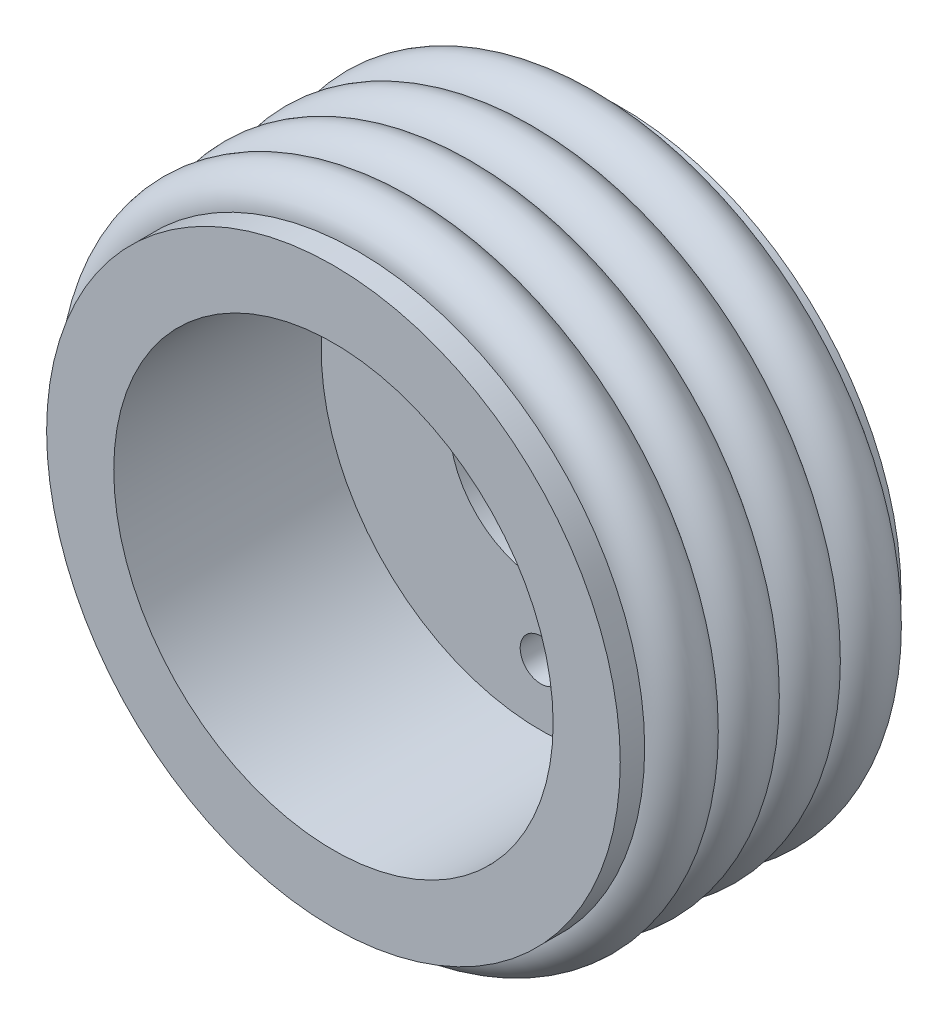
ISO-10303-21;
HEADER;
FILE_DESCRIPTION(('STEP AP214'),'2;1');
FILE_NAME('part.step','',(''),(''),'','','');
FILE_SCHEMA(('AUTOMOTIVE_DESIGN { 1 0 10303 214 1 1 1 1 }'));
ENDSEC;
DATA;
#1=APPLICATION_CONTEXT('core data for automotive mechanical design processes');
#2=APPLICATION_PROTOCOL_DEFINITION('international standard','automotive_design',2000,#1);
#3=PRODUCT_CONTEXT('',#1,'mechanical');
#4=PRODUCT('Part','Part','',(#3));
#5=PRODUCT_RELATED_PRODUCT_CATEGORY('part','',(#4));
#6=PRODUCT_DEFINITION_FORMATION('','',#4);
#7=PRODUCT_DEFINITION_CONTEXT('part definition',#1,'design');
#8=PRODUCT_DEFINITION('design','',#6,#7);
#9=PRODUCT_DEFINITION_SHAPE('','',#8);
#10=(LENGTH_UNIT() NAMED_UNIT(*) SI_UNIT(.MILLI.,.METRE.));
#11=(NAMED_UNIT(*) PLANE_ANGLE_UNIT() SI_UNIT($,.RADIAN.));
#12=(NAMED_UNIT(*) SI_UNIT($,.STERADIAN.) SOLID_ANGLE_UNIT());
#13=UNCERTAINTY_MEASURE_WITH_UNIT(LENGTH_MEASURE(1.E-05),#10,'distance_accuracy_value','');
#14=(GEOMETRIC_REPRESENTATION_CONTEXT(3) GLOBAL_UNCERTAINTY_ASSIGNED_CONTEXT((#13)) GLOBAL_UNIT_ASSIGNED_CONTEXT((#10,
#11,#12)) REPRESENTATION_CONTEXT('',''));
#15=CARTESIAN_POINT('',(0.,0.,0.));
#16=DIRECTION('',(0.,0.,1.));
#17=DIRECTION('',(1.,0.,0.));
#18=AXIS2_PLACEMENT_3D('',#15,#16,#17);
#19=CARTESIAN_POINT('',(0.,0.,-11.75));
#20=DIRECTION('',(0.,0.,-1.));
#21=DIRECTION('',(1.,0.,0.));
#22=AXIS2_PLACEMENT_3D('',#19,#20,#21);
#23=CYLINDRICAL_SURFACE('',#22,21.);
#24=CARTESIAN_POINT('',(0.,0.,9.75));
#25=DIRECTION('',(0.,0.,1.));
#26=DIRECTION('',(1.,0.,0.));
#27=AXIS2_PLACEMENT_3D('',#24,#25,#26);
#28=CIRCLE('',#27,21.);
#29=CARTESIAN_POINT('',(0.,21.,9.75));
#30=VERTEX_POINT('',#29);
#31=EDGE_CURVE('E77',#30,#30,#28,.T.);
#32=ORIENTED_EDGE('',*,*,#31,.F.);
#33=CARTESIAN_POINT('',(0.,21.,9.75));
#34=CARTESIAN_POINT('',(-0.0561363038988771,20.9999996811273,9.74999752135984));
#35=CARTESIAN_POINT('',(-0.112312501141531,20.9997724969274,9.74525719854788));
#36=CARTESIAN_POINT('',(-0.223115433296866,20.9988880545972,9.7264142023614));
#37=CARTESIAN_POINT('',(-0.27774025943396,20.9982302887367,9.71230047583736));
#38=CARTESIAN_POINT('',(-0.383819311213126,20.9965591372719,9.675115465787));
#39=CARTESIAN_POINT('',(-0.435275128016128,20.9955459318736,9.65204872076832));
#40=CARTESIAN_POINT('',(-0.533570370949644,20.9932780382918,9.59761936176998));
#41=CARTESIAN_POINT('',(-0.580410888609561,20.9920234074143,9.56625871581298));
#42=CARTESIAN_POINT('',(-0.668203464024752,20.9894125161618,9.49609918178456));
#43=CARTESIAN_POINT('',(-0.709150712799859,20.9880561741467,9.45729427866645));
#44=CARTESIAN_POINT('',(-0.783953466933909,20.9853954341331,9.37335966149667));
#45=CARTESIAN_POINT('',(-0.817808683669856,20.9840910382503,9.32822969015969));
#46=CARTESIAN_POINT('',(-0.877479198286772,20.9816807168435,9.23290130925095));
#47=CARTESIAN_POINT('',(-0.903290803156075,20.9805748825823,9.18270058554188));
#48=CARTESIAN_POINT('',(-0.946117685640341,20.9786873636158,9.07867201809471));
#49=CARTESIAN_POINT('',(-0.963133025422213,20.9779056766198,9.02484419999387));
#50=CARTESIAN_POINT('',(-0.987871838374909,20.9767553280768,8.91513309862436));
#51=CARTESIAN_POINT('',(-0.995602416726948,20.976386350718,8.85925142087096));
#52=CARTESIAN_POINT('',(-1.00157418334509,20.9761020812373,8.74698241613607));
#53=CARTESIAN_POINT('',(-0.999815441116711,20.9761867857924,8.69059509286125));
#54=CARTESIAN_POINT('',(-0.986864415771587,20.9768000345494,8.57896370364238));
#55=CARTESIAN_POINT('',(-0.975679808408722,20.9773282176127,8.52371874492955));
#56=CARTESIAN_POINT('',(-0.944206435455782,20.9787683216876,8.4158913813039));
#57=CARTESIAN_POINT('',(-0.923917634063143,20.9796802442083,8.36330898686262));
#58=CARTESIAN_POINT('',(-0.874803024000611,20.9817854593617,8.26227463931984));
#59=CARTESIAN_POINT('',(-0.84597371304432,20.9829788673847,8.21382439124423));
#60=CARTESIAN_POINT('',(-0.780598997705031,20.9855124233405,8.12244831396283));
#61=CARTESIAN_POINT('',(-0.744053544211555,20.9868525722071,8.079522519921));
#62=CARTESIAN_POINT('',(-0.664240605170176,20.9895301635977,8.00036917720809));
#63=CARTESIAN_POINT('',(-0.620966471781964,20.9908676021056,7.96414833129921));
#64=CARTESIAN_POINT('',(-0.52894794122871,20.9933877425387,7.89948470412643));
#65=CARTESIAN_POINT('',(-0.480203542796952,20.9945704444281,7.87104192466365));
#66=CARTESIAN_POINT('',(-0.378624262007521,20.9966478613264,7.82274247311842));
#67=CARTESIAN_POINT('',(-0.325789269850134,20.9975425686017,7.80288603160471));
#68=CARTESIAN_POINT('',(-0.217530322004393,20.9989430441434,7.772327273432));
#69=CARTESIAN_POINT('',(-0.162106383907505,20.9994488150522,7.76162489458217));
#70=CARTESIAN_POINT('',(-0.0503010224865294,21.0000140755397,7.74968631711494));
#71=CARTESIAN_POINT('',(0.00607940869278546,21.0000740022307,7.74844084678025));
#72=CARTESIAN_POINT('',(0.118248476151765,20.9997419804265,7.75542724949942));
#73=CARTESIAN_POINT('',(0.174037114203099,20.9993500332844,7.76365909417267));
#74=CARTESIAN_POINT('',(0.283413000445086,20.9981586951108,7.78935878129773));
#75=CARTESIAN_POINT('',(0.337001244760644,20.9973594906932,7.80682239369487));
#76=CARTESIAN_POINT('',(0.440485842440502,20.9954436287698,7.85048560023469));
#77=CARTESIAN_POINT('',(0.490382176546033,20.9943269696081,7.87668523994473));
#78=CARTESIAN_POINT('',(0.585109169143699,20.9919007529685,7.93710054849867));
#79=CARTESIAN_POINT('',(0.62993585746517,20.9905910461334,7.97132243620837));
#80=CARTESIAN_POINT('',(0.713211181457512,20.9879267461132,8.04680171479698));
#81=CARTESIAN_POINT('',(0.751659779802339,20.9865721526654,8.08805914684664));
#82=CARTESIAN_POINT('',(0.821118689748084,20.9839695151814,8.17647823223026));
#83=CARTESIAN_POINT('',(0.852123005059919,20.9827215575569,8.22364459892427));
#84=CARTESIAN_POINT('',(0.90577227043327,20.980474271694,8.32251883205619));
#85=CARTESIAN_POINT('',(0.928417254344898,20.9794749424489,8.37422668010286));
#86=CARTESIAN_POINT('',(0.964694583406498,20.9778382170924,8.48069381289652));
#87=CARTESIAN_POINT('',(0.978330759329323,20.9772006671595,8.53545178989719));
#88=CARTESIAN_POINT('',(0.996215923908415,20.976358960133,8.64648312915979));
#89=CARTESIAN_POINT('',(1.00046495929589,20.9761548008819,8.70275648387641));
#90=CARTESIAN_POINT('',(0.999454776551576,20.9762029522932,8.81516147431866));
#91=CARTESIAN_POINT('',(0.994204993279052,20.9764548100094,8.87129319527461));
#92=CARTESIAN_POINT('',(0.974365687272199,20.9773856516208,8.9818774089297));
#93=CARTESIAN_POINT('',(0.959776146615082,20.9780646363355,9.03632989840624));
#94=CARTESIAN_POINT('',(0.921673350457397,20.9797731033517,9.14201204336561));
#95=CARTESIAN_POINT('',(0.898160013112034,20.9808025888678,9.19324166928486));
#96=CARTESIAN_POINT('',(0.842878804483335,20.9830959888515,9.2910265033339));
#97=CARTESIAN_POINT('',(0.811111193018686,20.9843598959398,9.33758185853114));
#98=CARTESIAN_POINT('',(0.740189753734843,20.9869811044061,9.42474352556779));
#99=CARTESIAN_POINT('',(0.701029419988857,20.9883384873735,9.46534454097217));
#100=CARTESIAN_POINT('',(0.616437094470653,20.9909931173752,9.53940858935266));
#101=CARTESIAN_POINT('',(0.571003560745194,20.9922903495193,9.57286986221631));
#102=CARTESIAN_POINT('',(0.475121488390931,20.9946793241869,9.63171876461425));
#103=CARTESIAN_POINT('',(0.424668410693327,20.9957708780911,9.65709899792059));
#104=CARTESIAN_POINT('',(0.320249897572316,20.99762261114,9.69899817802257));
#105=CARTESIAN_POINT('',(0.266288701804138,20.9983831820344,9.71552760595094));
#106=CARTESIAN_POINT('',(0.176659513778952,20.9992857723808,9.73491374376));
#107=CARTESIAN_POINT('',(0.141572250394051,20.9995524328427,9.74056388235601));
#108=CARTESIAN_POINT('',(0.0709953108205627,20.9999096474265,9.74810779288838));
#109=CARTESIAN_POINT('',(0.0355056349415617,21.0000002016837,9.75000156771442));
#110=CARTESIAN_POINT('',(0.,21.,9.75));
#111=B_SPLINE_CURVE_WITH_KNOTS('',3,(#33,#34,#35,#36,#37,#38,#39,#40,#41,#42,#43,#44,#45,#46,
#47,#48,#49,#50,#51,#52,#53,#54,#55,#56,#57,#58,#59,#60,#61,#62,#63,#64,#65,#66,#67,#68,#69,#70,
#71,#72,#73,#74,#75,#76,#77,#78,#79,#80,#81,#82,#83,#84,#85,#86,#87,#88,#89,#90,#91,#92,#93,#94,
#95,#96,#97,#98,#99,#100,#101,#102,#103,#104,#105,#106,#107,#108,#109,#110),.UNSPECIFIED.,.T.,
.F.,(4,2,2,2,2,2,2,2,2,2,2,2,2,2,2,2,2,2,2,2,2,2,2,2,2,2,2,2,2,2,2,2,2,2,2,2,2,2,4),(0.,
0.168279304152174,0.336757397002164,0.505150195428666,0.673503072475897,0.841992557974523,
1.01048889912417,1.1790624873233,1.3476348841256,1.51607819822157,1.68452027853856,
1.85282532400345,2.02113103133967,2.1895058531327,2.35788174660333,2.52642506265313,
2.69496841773153,2.86351629842006,3.03206303401975,3.20044450211068,3.36882546597069,
3.53712934339233,3.70543409870555,3.87386975825859,4.04230640350093,4.21087827086856,
4.37944945561711,4.54794891342144,4.71644753239733,4.88477887918966,5.05311054900712,
5.22144376271946,5.38977167847142,5.55824842679306,5.72676666068431,5.89543869163227,
6.06391053675276,6.17034554801619,6.27678047740181),.UNSPECIFIED.);
#112=EDGE_CURVE('E74',#30,#30,#111,.T.);
#113=ORIENTED_EDGE('',*,*,#112,.T.);
#114=EDGE_LOOP('',(#32,#113));
#115=FACE_BOUND('',#114,.T.);
#116=CARTESIAN_POINT('',(0.,0.,-10.25));
#117=DIRECTION('',(0.,0.,1.));
#118=DIRECTION('',(1.,0.,0.));
#119=AXIS2_PLACEMENT_3D('',#116,#117,#118);
#120=CIRCLE('',#119,21.);
#121=CARTESIAN_POINT('',(0.,21.,-10.25));
#122=VERTEX_POINT('',#121);
#123=EDGE_CURVE('E200',#122,#122,#120,.T.);
#124=ORIENTED_EDGE('',*,*,#123,.T.);
#125=CARTESIAN_POINT('',(0.,21.,-8.25));
#126=CARTESIAN_POINT('',(-0.0561363038988737,20.9999996811273,-8.25000247864016));
#127=CARTESIAN_POINT('',(-0.112312501141527,20.9997724969274,-8.25474280145213));
#128=CARTESIAN_POINT('',(-0.223115433296863,20.9988880545972,-8.27358579763861));
#129=CARTESIAN_POINT('',(-0.277740259433957,20.9982302887367,-8.28769952416264));
#130=CARTESIAN_POINT('',(-0.383819311213123,20.9965591372719,-8.32488453421301));
#131=CARTESIAN_POINT('',(-0.435275128016124,20.9955459318736,-8.34795127923169));
#132=CARTESIAN_POINT('',(-0.53357037094964,20.9932780382918,-8.40238063823003));
#133=CARTESIAN_POINT('',(-0.580410888609558,20.9920234074143,-8.43374128418703));
#134=CARTESIAN_POINT('',(-0.66820346402475,20.9894125161618,-8.50390081821545));
#135=CARTESIAN_POINT('',(-0.709150712799856,20.9880561741467,-8.54270572133356));
#136=CARTESIAN_POINT('',(-0.783953466933907,20.9853954341331,-8.62664033850333));
#137=CARTESIAN_POINT('',(-0.817808683669854,20.9840910382503,-8.67177030984032));
#138=CARTESIAN_POINT('',(-0.87747919828677,20.9816807168435,-8.76709869074906));
#139=CARTESIAN_POINT('',(-0.903290803156073,20.9805748825823,-8.81729941445813));
#140=CARTESIAN_POINT('',(-0.946117685640338,20.9786873636158,-8.92132798190529));
#141=CARTESIAN_POINT('',(-0.963133025422211,20.9779056766198,-8.97515580000614));
#142=CARTESIAN_POINT('',(-0.987871838374906,20.9767553280768,-9.08486690137565));
#143=CARTESIAN_POINT('',(-0.995602416726945,20.976386350718,-9.14074857912905));
#144=CARTESIAN_POINT('',(-1.00157418334509,20.9761020812373,-9.25301758386394));
#145=CARTESIAN_POINT('',(-0.999815441116708,20.9761867857924,-9.30940490713876));
#146=CARTESIAN_POINT('',(-0.986864415771584,20.9768000345494,-9.42103629635763));
#147=CARTESIAN_POINT('',(-0.975679808408718,20.9773282176127,-9.47628125507046));
#148=CARTESIAN_POINT('',(-0.944206435455779,20.9787683216876,-9.58410861869611));
#149=CARTESIAN_POINT('',(-0.92391763406314,20.9796802442083,-9.63669101313739));
#150=CARTESIAN_POINT('',(-0.874803024000608,20.9817854593617,-9.73772536068017));
#151=CARTESIAN_POINT('',(-0.845973713044317,20.9829788673847,-9.78617560875577));
#152=CARTESIAN_POINT('',(-0.780598997705028,20.9855124233405,-9.87755168603717));
#153=CARTESIAN_POINT('',(-0.744053544211551,20.9868525722071,-9.92047748007901));
#154=CARTESIAN_POINT('',(-0.664240605170172,20.9895301635977,-9.99963082279192));
#155=CARTESIAN_POINT('',(-0.62096647178196,20.9908676021056,-10.0358516687008));
#156=CARTESIAN_POINT('',(-0.528947941228705,20.9933877425387,-10.1005152958736));
#157=CARTESIAN_POINT('',(-0.480203542796948,20.9945704444281,-10.1289580753364));
#158=CARTESIAN_POINT('',(-0.378624262007517,20.9966478613264,-10.1772575268816));
#159=CARTESIAN_POINT('',(-0.325789269850129,20.9975425686017,-10.1971139683953));
#160=CARTESIAN_POINT('',(-0.217530322004388,20.9989430441434,-10.227672726568));
#161=CARTESIAN_POINT('',(-0.162106383907501,20.9994488150522,-10.2383751054178));
#162=CARTESIAN_POINT('',(-0.0503010224865254,21.0000140755397,-10.2503136828851));
#163=CARTESIAN_POINT('',(0.00607940869278955,21.0000740022307,-10.2515591532198));
#164=CARTESIAN_POINT('',(0.118248476151769,20.9997419804265,-10.2445727505006));
#165=CARTESIAN_POINT('',(0.174037114203103,20.9993500332844,-10.2363409058273));
#166=CARTESIAN_POINT('',(0.283413000445091,20.9981586951108,-10.2106412187023));
#167=CARTESIAN_POINT('',(0.337001244760649,20.9973594906932,-10.1931776063051));
#168=CARTESIAN_POINT('',(0.440485842440507,20.9954436287698,-10.1495143997653));
#169=CARTESIAN_POINT('',(0.490382176546038,20.9943269696081,-10.1233147600553));
#170=CARTESIAN_POINT('',(0.585109169143704,20.9919007529685,-10.0628994515013));
#171=CARTESIAN_POINT('',(0.629935857465176,20.9905910461334,-10.0286775637916));
#172=CARTESIAN_POINT('',(0.713211181457518,20.9879267461132,-9.95319828520303));
#173=CARTESIAN_POINT('',(0.751659779802344,20.9865721526654,-9.91194085315336));
#174=CARTESIAN_POINT('',(0.821118689748088,20.9839695151814,-9.82352176776975));
#175=CARTESIAN_POINT('',(0.852123005059924,20.9827215575569,-9.77635540107574));
#176=CARTESIAN_POINT('',(0.905772270433275,20.980474271694,-9.67748116794382));
#177=CARTESIAN_POINT('',(0.928417254344902,20.9794749424489,-9.62577331989714));
#178=CARTESIAN_POINT('',(0.964694583406502,20.9778382170924,-9.51930618710349));
#179=CARTESIAN_POINT('',(0.978330759329327,20.9772006671595,-9.46454821010281));
#180=CARTESIAN_POINT('',(0.996215923908419,20.976358960133,-9.35351687084022));
#181=CARTESIAN_POINT('',(1.00046495929589,20.9761548008819,-9.29724351612359));
#182=CARTESIAN_POINT('',(0.999454776551579,20.9762029522932,-9.18483852568135));
#183=CARTESIAN_POINT('',(0.994204993279055,20.9764548100094,-9.1287068047254));
#184=CARTESIAN_POINT('',(0.974365687272203,20.9773856516208,-9.0181225910703));
#185=CARTESIAN_POINT('',(0.959776146615085,20.9780646363355,-8.96367010159377));
#186=CARTESIAN_POINT('',(0.9216733504574,20.9797731033517,-8.85798795663439));
#187=CARTESIAN_POINT('',(0.898160013112037,20.9808025888678,-8.80675833071514));
#188=CARTESIAN_POINT('',(0.842878804483338,20.9830959888515,-8.70897349666611));
#189=CARTESIAN_POINT('',(0.811111193018688,20.9843598959398,-8.66241814146887));
#190=CARTESIAN_POINT('',(0.740189753734846,20.9869811044061,-8.57525647443222));
#191=CARTESIAN_POINT('',(0.701029419988859,20.9883384873735,-8.53465545902784));
#192=CARTESIAN_POINT('',(0.616437094470656,20.9909931173752,-8.46059141064735));
#193=CARTESIAN_POINT('',(0.571003560745196,20.9922903495193,-8.42713013778369));
#194=CARTESIAN_POINT('',(0.475121488390934,20.9946793241869,-8.36828123538576));
#195=CARTESIAN_POINT('',(0.42466841069333,20.995770878091,-8.34290100207942));
#196=CARTESIAN_POINT('',(0.320249897572319,20.99762261114,-8.30100182197744));
#197=CARTESIAN_POINT('',(0.266288701804141,20.9983831820344,-8.28447239404907));
#198=CARTESIAN_POINT('',(0.176659513778955,20.9992857723808,-8.26508625624001));
#199=CARTESIAN_POINT('',(0.141572250394054,20.9995524328427,-8.259436117644));
#200=CARTESIAN_POINT('',(0.0709953108205658,20.9999096474265,-8.25189220711163));
#201=CARTESIAN_POINT('',(0.0355056349415649,21.0000002016837,-8.24999843228559));
#202=CARTESIAN_POINT('',(0.,21.,-8.25));
#203=B_SPLINE_CURVE_WITH_KNOTS('',3,(#125,#126,#127,#128,#129,#130,#131,#132,#133,#134,#135,
#136,#137,#138,#139,#140,#141,#142,#143,#144,#145,#146,#147,#148,#149,#150,#151,#152,#153,#154,
#155,#156,#157,#158,#159,#160,#161,#162,#163,#164,#165,#166,#167,#168,#169,#170,#171,#172,#173,
#174,#175,#176,#177,#178,#179,#180,#181,#182,#183,#184,#185,#186,#187,#188,#189,#190,#191,#192,
#193,#194,#195,#196,#197,#198,#199,#200,#201,#202),.UNSPECIFIED.,.T.,.F.,(4,2,2,2,2,2,2,2,2,2,2,
2,2,2,2,2,2,2,2,2,2,2,2,2,2,2,2,2,2,2,2,2,2,2,2,2,2,2,4),(0.,0.168279304152174,
0.336757397002165,0.505150195428666,0.673503072475898,0.841992557974524,1.01048889912418,
1.1790624873233,1.3476348841256,1.51607819822157,1.68452027853856,1.85282532400345,
2.02113103133967,2.1895058531327,2.35788174660333,2.52642506265313,2.69496841773153,
2.86351629842007,3.03206303401975,3.20044450211068,3.36882546597069,3.53712934339233,
3.70543409870556,3.87386975825859,4.04230640350094,4.21087827086856,4.37944945561712,
4.54794891342144,4.71644753239733,4.88477887918967,5.05311054900713,5.22144376271946,
5.38977167847143,5.55824842679306,5.72676666068431,5.89543869163227,6.06391053675277,
6.17034554801619,6.27678047740182),.UNSPECIFIED.);
#204=EDGE_CURVE('E86',#122,#122,#203,.T.);
#205=ORIENTED_EDGE('',*,*,#204,.T.);
#206=EDGE_LOOP('',(#124,#205));
#207=FACE_BOUND('',#206,.T.);
#208=ADVANCED_FACE('F46',(#115,#207),#23,.T.);
#209=CARTESIAN_POINT('',(0.,0.,-11.75));
#210=DIRECTION('',(0.,0.,-1.));
#211=DIRECTION('',(1.,0.,0.));
#212=AXIS2_PLACEMENT_3D('',#209,#210,#211);
#213=CYLINDRICAL_SURFACE('',#212,18.);
#214=CARTESIAN_POINT('',(0.,0.,-11.75));
#215=DIRECTION('',(0.,0.,1.));
#216=DIRECTION('',(1.,0.,0.));
#217=AXIS2_PLACEMENT_3D('',#214,#215,#216);
#218=CIRCLE('',#217,18.);
#219=CARTESIAN_POINT('',(18.,0.,-11.75));
#220=VERTEX_POINT('',#219);
#221=EDGE_CURVE('E169',#220,#220,#218,.T.);
#222=ORIENTED_EDGE('',*,*,#221,.F.);
#223=EDGE_LOOP('',(#222));
#224=FACE_BOUND('',#223,.T.);
#225=CARTESIAN_POINT('',(0.,0.,-8.25));
#226=DIRECTION('',(0.,0.,1.));
#227=DIRECTION('',(1.,0.,0.));
#228=AXIS2_PLACEMENT_3D('',#225,#226,#227);
#229=CIRCLE('',#228,18.);
#230=CARTESIAN_POINT('',(0.,18.,-8.25));
#231=VERTEX_POINT('',#230);
#232=EDGE_CURVE('E148',#231,#231,#229,.T.);
#233=ORIENTED_EDGE('',*,*,#232,.T.);
#234=CARTESIAN_POINT('',(0.,18.,-8.25));
#235=CARTESIAN_POINT('',(0.0561239921353609,17.9999996293436,-8.25000247387468));
#236=CARTESIAN_POINT('',(0.112287575691352,17.9997346985376,-8.25474072600694));
#237=CARTESIAN_POINT('',(0.223064783996273,17.998703306687,-8.27357501755922));
#238=CARTESIAN_POINT('',(0.277676513439528,17.9979362577337,-8.28768202673791));
#239=CARTESIAN_POINT('',(0.383729308134845,17.9959874286263,-8.32484814795538));
#240=CARTESIAN_POINT('',(0.435171997004065,17.9948058629571,-8.34790263092066));
#241=CARTESIAN_POINT('',(0.533443576300591,17.9921609982496,-8.40230198930911));
#242=CARTESIAN_POINT('',(0.580273538812991,17.9906977649107,-8.43364493206731));
#243=CARTESIAN_POINT('',(0.66806090342466,17.9876521295733,-8.50377351053331));
#244=CARTESIAN_POINT('',(0.709011992521201,17.9860696022108,-8.54256704408775));
#245=CARTESIAN_POINT('',(0.783825267439436,17.982964815179,-8.62647957007048));
#246=CARTESIAN_POINT('',(0.817687160941333,17.9814425579971,-8.67159882320893));
#247=CARTESIAN_POINT('',(0.877379272633477,17.9786290463598,-8.76691646802115));
#248=CARTESIAN_POINT('',(0.903204401942787,17.9773379384872,-8.81711805127631));
#249=CARTESIAN_POINT('',(0.946057301709301,17.9751338980233,-8.92115289492121));
#250=CARTESIAN_POINT('',(0.963085150518929,17.974220962064,-8.97498612296111));
#251=CARTESIAN_POINT('',(0.987843024712242,17.9728773805257,-9.08469665214943));
#252=CARTESIAN_POINT('',(0.995582722396983,17.972446233264,-9.14057176435145));
#253=CARTESIAN_POINT('',(1.00157444251924,17.9721133448409,-9.252829649238));
#254=CARTESIAN_POINT('',(0.99982655340841,17.972211598744,-9.30921241718482));
#255=CARTESIAN_POINT('',(0.986900758416197,17.9729259665874,-9.42081930286214));
#256=CARTESIAN_POINT('',(0.975733309389436,17.9735415062748,-9.47604463584282));
#257=CARTESIAN_POINT('',(0.9443016085512,17.9752201680634,-9.58383563161546));
#258=CARTESIAN_POINT('',(0.92403731158699,17.9762832923862,-9.63640128120449));
#259=CARTESIAN_POINT('',(0.874975231054385,17.9787379684647,-9.73741441585432));
#260=CARTESIAN_POINT('',(0.846172690028003,17.9801297032319,-9.78585958559048));
#261=CARTESIAN_POINT('',(0.780855177055611,17.9830845624967,-9.87723126199387));
#262=CARTESIAN_POINT('',(0.744340137212846,17.9846476885029,-9.92015772007194));
#263=CARTESIAN_POINT('',(0.664575192903928,17.9877717128263,-9.99933430112583));
#264=CARTESIAN_POINT('',(0.621316235541244,17.9893326052606,-10.0355753047931));
#265=CARTESIAN_POINT('',(0.529323201320925,17.9922742083306,-10.1002819280783));
#266=CARTESIAN_POINT('',(0.480589122898997,17.9936549189148,-10.1287475454749));
#267=CARTESIAN_POINT('',(0.379023810722915,17.9960806400487,-10.1770945307742));
#268=CARTESIAN_POINT('',(0.326192419765677,17.99712563771,-10.196975569117));
#269=CARTESIAN_POINT('',(0.217934580838149,17.9987619858453,-10.2275830315016));
#270=CARTESIAN_POINT('',(0.162508156835346,17.9993533405082,-10.2383095400763));
#271=CARTESIAN_POINT('',(0.0507127526679019,18.0000152213332,-10.2502921921279));
#272=CARTESIAN_POINT('',(-0.00565487183184837,18.0000864410665,-10.2515609470443));
#273=CARTESIAN_POINT('',(-0.11780218687658,17.9997018687927,-10.2446250048789));
#274=CARTESIAN_POINT('',(-0.173581879829545,17.9992460789449,-10.2364203466126));
#275=CARTESIAN_POINT('',(-0.282934534050308,17.9978592597183,-10.2107809180312));
#276=CARTESIAN_POINT('',(-0.336508852259524,17.9969285274361,-10.1933519176788));
#277=CARTESIAN_POINT('',(-0.439971813730561,17.9946965786367,-10.1497644040286));
#278=CARTESIAN_POINT('',(-0.489860430773251,17.9933953594843,-10.1236058286382));
#279=CARTESIAN_POINT('',(-0.584593678480969,17.9905670178977,-10.0632694988903));
#280=CARTESIAN_POINT('',(-0.629432925828729,17.9890396583071,-10.0290833035402));
#281=CARTESIAN_POINT('',(-0.712740457924877,17.9859317886593,-9.95367446762279));
#282=CARTESIAN_POINT('',(-0.7512086927092,17.9843512781855,-9.91245177187762));
#283=CARTESIAN_POINT('',(-0.820724796456359,17.9813132522414,-9.82408577681196));
#284=CARTESIAN_POINT('',(-0.851764496574282,17.9798558733024,-9.77693604586204));
#285=CARTESIAN_POINT('',(-0.905486578704715,17.9772306140937,-9.67808681168182));
#286=CARTESIAN_POINT('',(-0.928169003442369,17.976062732344,-9.62638733171301));
#287=CARTESIAN_POINT('',(-0.96451846069923,17.9741491468711,-9.51993624371551));
#288=CARTESIAN_POINT('',(-0.978190673181661,17.9734032006125,-9.4651864090039));
#289=CARTESIAN_POINT('',(-0.996148533558673,17.972416927768,-9.35416402035048));
#290=CARTESIAN_POINT('',(-1.00043425133712,17.9721765974177,-9.29789147774861));
#291=CARTESIAN_POINT('',(-0.999496807352775,17.9722287497404,-9.18550231376969));
#292=CARTESIAN_POINT('',(-0.994286492489999,17.9725205125607,-9.12938558444844));
#293=CARTESIAN_POINT('',(-0.974531474958031,17.9736024468818,-9.01882497418949));
#294=CARTESIAN_POINT('',(-0.959986754836635,17.9743926193146,-8.96438109637964));
#295=CARTESIAN_POINT('',(-0.921978548324376,17.9763821511641,-8.85870931017505));
#296=CARTESIAN_POINT('',(-0.898515044096341,17.9775815113993,-8.80748140821236));
#297=CARTESIAN_POINT('',(-0.843337295917775,17.9802542192312,-8.70969082173325));
#298=CARTESIAN_POINT('',(-0.811623288639576,17.9817275589683,-8.66312800344821));
#299=CARTESIAN_POINT('',(-0.740797976388991,17.9847844794412,-8.57592464590356));
#300=CARTESIAN_POINT('',(-0.701677541013743,17.9863681947053,-8.53529152724154));
#301=CARTESIAN_POINT('',(-0.61715919029839,17.9894663289624,-8.46115612046441));
#302=CARTESIAN_POINT('',(-0.571759736548343,17.9909807308517,-8.42765558501313));
#303=CARTESIAN_POINT('',(-0.475929780480006,17.9937708547196,-8.36871690802663));
#304=CARTESIAN_POINT('',(-0.4254939282812,17.9950463186631,-8.3432874623334));
#305=CARTESIAN_POINT('',(-0.321098790648485,17.9972111729042,-8.30128823996916));
#306=CARTESIAN_POINT('',(-0.267143736726643,17.9981010173748,-8.28470803551767));
#307=CARTESIAN_POINT('',(-0.177379649657103,17.9991599102247,-8.2652104341454));
#308=CARTESIAN_POINT('',(-0.14215154946696,17.9994735529059,-8.2595138423788));
#309=CARTESIAN_POINT('',(-0.0712876245463929,17.9998937154093,-8.25190784158824));
#310=CARTESIAN_POINT('',(-0.0356518002520928,18.0000002354531,-8.24999842851368));
#311=CARTESIAN_POINT('',(0.,18.,-8.25));
#312=B_SPLINE_CURVE_WITH_KNOTS('',3,(#234,#235,#236,#237,#238,#239,#240,#241,#242,#243,#244,
#245,#246,#247,#248,#249,#250,#251,#252,#253,#254,#255,#256,#257,#258,#259,#260,#261,#262,#263,
#264,#265,#266,#267,#268,#269,#270,#271,#272,#273,#274,#275,#276,#277,#278,#279,#280,#281,#282,
#283,#284,#285,#286,#287,#288,#289,#290,#291,#292,#293,#294,#295,#296,#297,#298,#299,#300,#301,
#302,#303,#304,#305,#306,#307,#308,#309,#310,#311),.UNSPECIFIED.,.T.,.F.,(4,2,2,2,2,2,2,2,2,2,2,
2,2,2,2,2,2,2,2,2,2,2,2,2,2,2,2,2,2,2,2,2,2,2,2,2,2,2,4),(0.,0.168241830775914,
0.336681001905331,0.505033145104327,0.673346067285251,0.841838400834263,1.01033768072117,
1.17894343831504,1.34754769420648,1.51597621973303,1.68440317502297,1.85264340165883,
2.02088446337412,2.18921944475905,2.35755590813775,2.5261203202299,2.69468478048264,
2.86325571131201,3.03182508554267,3.2001696407048,3.36851350611201,3.53675219417456,
3.70499207892868,3.87340966535294,4.0418285725137,4.21043184047636,4.37903424647163,
4.54753963833574,4.71604377564768,4.88432011792095,5.05259677481541,5.22087376825751,
5.38914593507053,5.55762690921559,5.72614923592065,5.89485251808262,6.06335656206396,
6.17022940435465,6.27710213233886),.UNSPECIFIED.);
#313=EDGE_CURVE('E80',#231,#231,#312,.T.);
#314=ORIENTED_EDGE('',*,*,#313,.T.);
#315=EDGE_LOOP('',(#233,#314));
#316=FACE_BOUND('',#315,.T.);
#317=ADVANCED_FACE('F107',(#224,#316),#213,.F.);
#318=CARTESIAN_POINT('',(0.,0.,-11.75));
#319=DIRECTION('',(0.,0.,-1.));
#320=DIRECTION('',(1.,0.,0.));
#321=AXIS2_PLACEMENT_3D('',#318,#319,#320);
#322=CYLINDRICAL_SURFACE('',#321,18.);
#323=CARTESIAN_POINT('',(0.,18.,9.75));
#324=CARTESIAN_POINT('',(0.0561239921353575,17.9999996293436,9.74999752612532));
#325=CARTESIAN_POINT('',(0.112287575691349,17.9997346985376,9.74525927399306));
#326=CARTESIAN_POINT('',(0.223064783996269,17.998703306687,9.72642498244078));
#327=CARTESIAN_POINT('',(0.277676513439524,17.9979362577337,9.7123179732621));
#328=CARTESIAN_POINT('',(0.383729308134841,17.9959874286262,9.67515185204462));
#329=CARTESIAN_POINT('',(0.435171997004061,17.9948058629571,9.65209736907935));
#330=CARTESIAN_POINT('',(0.533443576300586,17.9921609982496,9.5976980106909));
#331=CARTESIAN_POINT('',(0.580273538812987,17.9906977649107,9.56635506793269));
#332=CARTESIAN_POINT('',(0.668060903424656,17.9876521295733,9.4962264894667));
#333=CARTESIAN_POINT('',(0.709011992521197,17.9860696022108,9.45743295591225));
#334=CARTESIAN_POINT('',(0.783825267439432,17.982964815179,9.37352042992953));
#335=CARTESIAN_POINT('',(0.817687160941329,17.9814425579971,9.32840117679108));
#336=CARTESIAN_POINT('',(0.877379272633473,17.9786290463598,9.23308353197886));
#337=CARTESIAN_POINT('',(0.903204401942782,17.9773379384872,9.1828819487237));
#338=CARTESIAN_POINT('',(0.946057301709297,17.9751338980233,9.0788471050788));
#339=CARTESIAN_POINT('',(0.963085150518925,17.974220962064,9.0250138770389));
#340=CARTESIAN_POINT('',(0.987843024712238,17.9728773805257,8.91530334785057));
#341=CARTESIAN_POINT('',(0.995582722396979,17.972446233264,8.85942823564856));
#342=CARTESIAN_POINT('',(1.00157444251924,17.9721133448409,8.74717035076201));
#343=CARTESIAN_POINT('',(0.999826553408406,17.972211598744,8.69078758281519));
#344=CARTESIAN_POINT('',(0.986900758416193,17.9729259665874,8.57918069713787));
#345=CARTESIAN_POINT('',(0.975733309389432,17.9735415062748,8.52395536415719));
#346=CARTESIAN_POINT('',(0.944301608551196,17.9752201680634,8.41616436838455));
#347=CARTESIAN_POINT('',(0.924037311586987,17.9762832923862,8.36359871879552));
#348=CARTESIAN_POINT('',(0.874975231054382,17.9787379684647,8.26258558414568));
#349=CARTESIAN_POINT('',(0.846172690028001,17.9801297032319,8.21414041440953));
#350=CARTESIAN_POINT('',(0.780855177055608,17.9830845624967,8.12276873800614));
#351=CARTESIAN_POINT('',(0.744340137212843,17.9846476885029,8.07984227992807));
#352=CARTESIAN_POINT('',(0.664575192903926,17.9877717128263,8.00066569887418));
#353=CARTESIAN_POINT('',(0.621316235541242,17.9893326052606,7.96442469520696));
#354=CARTESIAN_POINT('',(0.529323201320924,17.9922742083306,7.89971807192169));
#355=CARTESIAN_POINT('',(0.480589122898995,17.9936549189148,7.87125245452515));
#356=CARTESIAN_POINT('',(0.379023810722913,17.9960806400487,7.82290546922577));
#357=CARTESIAN_POINT('',(0.326192419765675,17.99712563771,7.803024430883));
#358=CARTESIAN_POINT('',(0.217934580838147,17.9987619858453,7.77241696849838));
#359=CARTESIAN_POINT('',(0.162508156835345,17.9993533405082,7.76169045992373));
#360=CARTESIAN_POINT('',(0.0507127526679,18.0000152213332,7.74970780787209));
#361=CARTESIAN_POINT('',(-0.00565487183185017,18.0000864410665,7.74843905295576));
#362=CARTESIAN_POINT('',(-0.117802186876581,17.9997018687927,7.75537499512112));
#363=CARTESIAN_POINT('',(-0.173581879829546,17.9992460789449,7.76357965338744));
#364=CARTESIAN_POINT('',(-0.282934534050309,17.9978592597183,7.78921908196882));
#365=CARTESIAN_POINT('',(-0.336508852259525,17.9969285274361,7.80664808232118));
#366=CARTESIAN_POINT('',(-0.439971813730562,17.9946965786367,7.85023559597137));
#367=CARTESIAN_POINT('',(-0.489860430773253,17.9933953594843,7.87639417136184));
#368=CARTESIAN_POINT('',(-0.584593678480971,17.9905670178977,7.93673050110971));
#369=CARTESIAN_POINT('',(-0.629432925828731,17.9890396583071,7.97091669645985));
#370=CARTESIAN_POINT('',(-0.712740457924879,17.9859317886593,8.04632553237722));
#371=CARTESIAN_POINT('',(-0.751208692709202,17.9843512781855,8.08754822812239));
#372=CARTESIAN_POINT('',(-0.820724796456362,17.9813132522414,8.17591422318805));
#373=CARTESIAN_POINT('',(-0.851764496574285,17.9798558733023,8.22306395413797));
#374=CARTESIAN_POINT('',(-0.905486578704718,17.9772306140937,8.32191318831818));
#375=CARTESIAN_POINT('',(-0.928169003442371,17.976062732344,8.373612668287));
#376=CARTESIAN_POINT('',(-0.964518460699233,17.9741491468711,8.4800637562845));
#377=CARTESIAN_POINT('',(-0.978190673181664,17.9734032006125,8.53481359099611));
#378=CARTESIAN_POINT('',(-0.996148533558676,17.972416927768,8.64583597964953));
#379=CARTESIAN_POINT('',(-1.00043425133712,17.9721765974177,8.70210852225139));
#380=CARTESIAN_POINT('',(-0.999496807352778,17.9722287497404,8.81449768623032));
#381=CARTESIAN_POINT('',(-0.994286492490002,17.9725205125607,8.87061441555156));
#382=CARTESIAN_POINT('',(-0.974531474958035,17.9736024468818,8.98117502581052));
#383=CARTESIAN_POINT('',(-0.959986754836638,17.9743926193146,9.03561890362037));
#384=CARTESIAN_POINT('',(-0.92197854832438,17.9763821511641,9.14129068982495));
#385=CARTESIAN_POINT('',(-0.898515044096344,17.9775815113993,9.19251859178765));
#386=CARTESIAN_POINT('',(-0.843337295917779,17.9802542192312,9.29030917826675));
#387=CARTESIAN_POINT('',(-0.81162328863958,17.9817275589683,9.33687199655179));
#388=CARTESIAN_POINT('',(-0.740797976388996,17.9847844794412,9.42407535409644));
#389=CARTESIAN_POINT('',(-0.701677541013748,17.9863681947053,9.46470847275846));
#390=CARTESIAN_POINT('',(-0.617159190298395,17.9894663289624,9.5388438795356));
#391=CARTESIAN_POINT('',(-0.571759736548348,17.9909807308517,9.57234441498687));
#392=CARTESIAN_POINT('',(-0.475929780480011,17.9937708547196,9.63128309197337));
#393=CARTESIAN_POINT('',(-0.425493928281205,17.9950463186631,9.65671253766661));
#394=CARTESIAN_POINT('',(-0.321098790648489,17.9972111729042,9.69871176003085));
#395=CARTESIAN_POINT('',(-0.267143736726647,17.9981010173748,9.71529196448234));
#396=CARTESIAN_POINT('',(-0.177379649657107,17.9991599102247,9.7347895658546));
#397=CARTESIAN_POINT('',(-0.142151549466965,17.9994735529059,9.74048615762121));
#398=CARTESIAN_POINT('',(-0.0712876245463971,17.9998937154093,9.74809215841177));
#399=CARTESIAN_POINT('',(-0.0356518002520966,18.0000002354531,9.75000157148633));
#400=CARTESIAN_POINT('',(0.,18.,9.75));
#401=B_SPLINE_CURVE_WITH_KNOTS('',3,(#323,#324,#325,#326,#327,#328,#329,#330,#331,#332,#333,
#334,#335,#336,#337,#338,#339,#340,#341,#342,#343,#344,#345,#346,#347,#348,#349,#350,#351,#352,
#353,#354,#355,#356,#357,#358,#359,#360,#361,#362,#363,#364,#365,#366,#367,#368,#369,#370,#371,
#372,#373,#374,#375,#376,#377,#378,#379,#380,#381,#382,#383,#384,#385,#386,#387,#388,#389,#390,
#391,#392,#393,#394,#395,#396,#397,#398,#399,#400),.UNSPECIFIED.,.T.,.F.,(4,2,2,2,2,2,2,2,2,2,2,
2,2,2,2,2,2,2,2,2,2,2,2,2,2,2,2,2,2,2,2,2,2,2,2,2,2,2,4),(0.,0.168241830775913,0.33668100190533,
0.505033145104326,0.67334606728525,0.841838400834262,1.01033768072116,1.17894343831504,
1.34754769420648,1.51597621973303,1.68440317502296,1.85264340165883,2.02088446337411,
2.18921944475905,2.35755590813775,2.5261203202299,2.69468478048264,2.86325571131201,
3.03182508554267,3.2001696407048,3.368513506112,3.53675219417456,3.70499207892868,
3.87340966535293,4.0418285725137,4.21043184047635,4.37903424647162,4.54753963833574,
4.71604377564767,4.88432011792095,5.05259677481541,5.2208737682575,5.38914593507053,
5.55762690921558,5.72614923592064,5.89485251808262,6.06335656206396,6.17022940435464,
6.27710213233885),.UNSPECIFIED.);
#402=CARTESIAN_POINT('',(0.,18.,9.75));
#403=VERTEX_POINT('',#402);
#404=EDGE_CURVE('E79',#403,#403,#401,.T.);
#405=ORIENTED_EDGE('',*,*,#404,.T.);
#406=EDGE_LOOP('',(#405));
#407=FACE_BOUND('',#406,.T.);
#408=CARTESIAN_POINT('',(0.,0.,-5.25));
#409=DIRECTION('',(0.,0.,1.));
#410=DIRECTION('',(1.,0.,0.));
#411=AXIS2_PLACEMENT_3D('',#408,#409,#410);
#412=CIRCLE('',#411,18.);
#413=CARTESIAN_POINT('',(0.,18.,-5.25));
#414=VERTEX_POINT('',#413);
#415=EDGE_CURVE('E54',#414,#414,#412,.T.);
#416=ORIENTED_EDGE('',*,*,#415,.F.);
#417=EDGE_LOOP('',(#416));
#418=FACE_BOUND('',#417,.T.);
#419=CARTESIAN_POINT('',(0.,0.,11.75));
#420=DIRECTION('',(0.,0.,1.));
#421=DIRECTION('',(1.,0.,0.));
#422=AXIS2_PLACEMENT_3D('',#419,#420,#421);
#423=CIRCLE('',#422,18.);
#424=CARTESIAN_POINT('',(18.,0.,11.75));
#425=VERTEX_POINT('',#424);
#426=EDGE_CURVE('E12',#425,#425,#423,.T.);
#427=ORIENTED_EDGE('',*,*,#426,.T.);
#428=EDGE_LOOP('',(#427));
#429=FACE_BOUND('',#428,.T.);
#430=ADVANCED_FACE('F178',(#407,#418,#429),#322,.F.);
#431=CARTESIAN_POINT('',(0.,18.,11.75));
#432=DIRECTION('',(0.,0.,-1.));
#433=DIRECTION('',(1.,0.,0.));
#434=AXIS2_PLACEMENT_3D('',#431,#432,#433);
#435=PLANE('',#434);
#436=ORIENTED_EDGE('',*,*,#426,.F.);
#437=EDGE_LOOP('',(#436));
#438=FACE_BOUND('',#437,.T.);
#439=CARTESIAN_POINT('',(0.,0.,11.75));
#440=DIRECTION('',(0.,0.,1.));
#441=DIRECTION('',(1.,0.,0.));
#442=AXIS2_PLACEMENT_3D('',#439,#440,#441);
#443=CIRCLE('',#442,23.5);
#444=CARTESIAN_POINT('',(23.5,0.,11.75));
#445=VERTEX_POINT('',#444);
#446=EDGE_CURVE('E83',#445,#445,#443,.T.);
#447=ORIENTED_EDGE('',*,*,#446,.T.);
#448=EDGE_LOOP('',(#447));
#449=FACE_BOUND('',#448,.T.);
#450=ADVANCED_FACE('F48',(#438,#449),#435,.F.);
#451=CARTESIAN_POINT('',(0.,7.5,-5.25));
#452=DIRECTION('',(0.,0.,-1.));
#453=DIRECTION('',(1.,0.,0.));
#454=AXIS2_PLACEMENT_3D('',#451,#452,#453);
#455=PLANE('',#454);
#456=CARTESIAN_POINT('',(0.,13.,-5.25));
#457=DIRECTION('',(0.,0.,1.));
#458=DIRECTION('',(1.,0.,0.));
#459=AXIS2_PLACEMENT_3D('',#456,#457,#458);
#460=CIRCLE('',#459,1.25);
#461=CARTESIAN_POINT('',(1.25,13.,-5.25));
#462=VERTEX_POINT('',#461);
#463=EDGE_CURVE('E137',#462,#462,#460,.T.);
#464=ORIENTED_EDGE('',*,*,#463,.F.);
#465=EDGE_LOOP('',(#464));
#466=FACE_BOUND('',#465,.T.);
#467=CARTESIAN_POINT('',(11.2583302491977,6.49999999999997,-5.25));
#468=DIRECTION('',(0.,0.,1.));
#469=DIRECTION('',(1.,0.,0.));
#470=AXIS2_PLACEMENT_3D('',#467,#468,#469);
#471=CIRCLE('',#470,1.7);
#472=CARTESIAN_POINT('',(12.9583302491977,6.49999999999997,-5.25));
#473=VERTEX_POINT('',#472);
#474=EDGE_CURVE('E204',#473,#473,#471,.T.);
#475=ORIENTED_EDGE('',*,*,#474,.F.);
#476=EDGE_LOOP('',(#475));
#477=FACE_BOUND('',#476,.T.);
#478=CARTESIAN_POINT('',(2.67147415300428E-13,-12.9999999999998,-5.25));
#479=DIRECTION('',(0.,0.,1.));
#480=DIRECTION('',(1.,0.,0.));
#481=AXIS2_PLACEMENT_3D('',#478,#479,#480);
#482=CIRCLE('',#481,1.7);
#483=CARTESIAN_POINT('',(1.70000000000026,-12.9999999999998,-5.25));
#484=VERTEX_POINT('',#483);
#485=EDGE_CURVE('E208',#484,#484,#482,.T.);
#486=ORIENTED_EDGE('',*,*,#485,.F.);
#487=EDGE_LOOP('',(#486));
#488=FACE_BOUND('',#487,.T.);
#489=CARTESIAN_POINT('',(-11.2583302491974,6.49999999999986,-5.25));
#490=DIRECTION('',(0.,0.,1.));
#491=DIRECTION('',(1.,0.,0.));
#492=AXIS2_PLACEMENT_3D('',#489,#490,#491);
#493=CIRCLE('',#492,1.7);
#494=CARTESIAN_POINT('',(-9.55833024919739,6.49999999999986,-5.25));
#495=VERTEX_POINT('',#494);
#496=EDGE_CURVE('E212',#495,#495,#493,.T.);
#497=ORIENTED_EDGE('',*,*,#496,.F.);
#498=EDGE_LOOP('',(#497));
#499=FACE_BOUND('',#498,.T.);
#500=ORIENTED_EDGE('',*,*,#415,.T.);
#501=CARTESIAN_POINT('',(0.,17.,-5.25));
#502=DIRECTION('',(0.,0.,1.));
#503=DIRECTION('',(1.,0.,0.));
#504=AXIS2_PLACEMENT_3D('',#501,#502,#503);
#505=CIRCLE('',#504,1.);
#506=EDGE_CURVE('E59',#414,#414,#505,.T.);
#507=ORIENTED_EDGE('',*,*,#506,.F.);
#508=EDGE_LOOP('',(#500,#507));
#509=FACE_BOUND('',#508,.T.);
#510=CARTESIAN_POINT('',(0.,0.,-5.25));
#511=DIRECTION('',(0.,0.,1.));
#512=DIRECTION('',(1.,0.,0.));
#513=AXIS2_PLACEMENT_3D('',#510,#511,#512);
#514=CIRCLE('',#513,7.5);
#515=CARTESIAN_POINT('',(7.5,0.,-5.25));
#516=VERTEX_POINT('',#515);
#517=EDGE_CURVE('E165',#516,#516,#514,.T.);
#518=ORIENTED_EDGE('',*,*,#517,.F.);
#519=EDGE_LOOP('',(#518));
#520=FACE_BOUND('',#519,.T.);
#521=ADVANCED_FACE('F175',(#466,#477,#488,#499,#509,#520),#455,.F.);
#522=CARTESIAN_POINT('',(0.,0.,-11.75));
#523=DIRECTION('',(0.,0.,-1.));
#524=DIRECTION('',(1.,0.,0.));
#525=AXIS2_PLACEMENT_3D('',#522,#523,#524);
#526=CYLINDRICAL_SURFACE('',#525,7.5);
#527=ORIENTED_EDGE('',*,*,#517,.T.);
#528=EDGE_LOOP('',(#527));
#529=FACE_BOUND('',#528,.T.);
#530=CARTESIAN_POINT('',(0.,0.,-8.25));
#531=DIRECTION('',(0.,0.,1.));
#532=DIRECTION('',(1.,0.,0.));
#533=AXIS2_PLACEMENT_3D('',#530,#531,#532);
#534=CIRCLE('',#533,7.5);
#535=CARTESIAN_POINT('',(7.5,0.,-8.25));
#536=VERTEX_POINT('',#535);
#537=EDGE_CURVE('E163',#536,#536,#534,.T.);
#538=ORIENTED_EDGE('',*,*,#537,.F.);
#539=EDGE_LOOP('',(#538));
#540=FACE_BOUND('',#539,.T.);
#541=ADVANCED_FACE('F144',(#529,#540),#526,.F.);
#542=CARTESIAN_POINT('',(0.,7.5,-8.25));
#543=DIRECTION('',(0.,0.,1.));
#544=DIRECTION('',(-1.,0.,0.));
#545=AXIS2_PLACEMENT_3D('',#542,#543,#544);
#546=PLANE('',#545);
#547=CARTESIAN_POINT('',(0.,13.,-8.25));
#548=DIRECTION('',(0.,0.,1.));
#549=DIRECTION('',(1.,0.,0.));
#550=AXIS2_PLACEMENT_3D('',#547,#548,#549);
#551=CIRCLE('',#550,1.25);
#552=CARTESIAN_POINT('',(1.25,13.,-8.25));
#553=VERTEX_POINT('',#552);
#554=EDGE_CURVE('E134',#553,#553,#551,.T.);
#555=ORIENTED_EDGE('',*,*,#554,.T.);
#556=EDGE_LOOP('',(#555));
#557=FACE_BOUND('',#556,.T.);
#558=ORIENTED_EDGE('',*,*,#232,.F.);
#559=CARTESIAN_POINT('',(0.,17.,-8.25));
#560=DIRECTION('',(0.,0.,1.));
#561=DIRECTION('',(1.,0.,0.));
#562=AXIS2_PLACEMENT_3D('',#559,#560,#561);
#563=CIRCLE('',#562,1.);
#564=EDGE_CURVE('E65',#231,#231,#563,.T.);
#565=ORIENTED_EDGE('',*,*,#564,.T.);
#566=EDGE_LOOP('',(#558,#565));
#567=FACE_BOUND('',#566,.T.);
#568=CARTESIAN_POINT('',(11.2583302491977,6.49999999999997,-8.25));
#569=DIRECTION('',(0.,0.,1.));
#570=DIRECTION('',(1.,0.,0.));
#571=AXIS2_PLACEMENT_3D('',#568,#569,#570);
#572=CIRCLE('',#571,1.7);
#573=CARTESIAN_POINT('',(12.9583302491977,6.49999999999997,-8.25));
#574=VERTEX_POINT('',#573);
#575=EDGE_CURVE('E152',#574,#574,#572,.T.);
#576=ORIENTED_EDGE('',*,*,#575,.T.);
#577=EDGE_LOOP('',(#576));
#578=FACE_BOUND('',#577,.T.);
#579=CARTESIAN_POINT('',(2.67147415300428E-13,-12.9999999999998,-8.25));
#580=DIRECTION('',(0.,0.,1.));
#581=DIRECTION('',(1.,0.,0.));
#582=AXIS2_PLACEMENT_3D('',#579,#580,#581);
#583=CIRCLE('',#582,1.7);
#584=CARTESIAN_POINT('',(1.70000000000026,-12.9999999999998,-8.25));
#585=VERTEX_POINT('',#584);
#586=EDGE_CURVE('E156',#585,#585,#583,.T.);
#587=ORIENTED_EDGE('',*,*,#586,.T.);
#588=EDGE_LOOP('',(#587));
#589=FACE_BOUND('',#588,.T.);
#590=CARTESIAN_POINT('',(-11.2583302491974,6.49999999999986,-8.25));
#591=DIRECTION('',(0.,0.,1.));
#592=DIRECTION('',(1.,0.,0.));
#593=AXIS2_PLACEMENT_3D('',#590,#591,#592);
#594=CIRCLE('',#593,1.7);
#595=CARTESIAN_POINT('',(-9.55833024919739,6.49999999999986,-8.25));
#596=VERTEX_POINT('',#595);
#597=EDGE_CURVE('E160',#596,#596,#594,.T.);
#598=ORIENTED_EDGE('',*,*,#597,.T.);
#599=EDGE_LOOP('',(#598));
#600=FACE_BOUND('',#599,.T.);
#601=ORIENTED_EDGE('',*,*,#537,.T.);
#602=EDGE_LOOP('',(#601));
#603=FACE_BOUND('',#602,.T.);
#604=ADVANCED_FACE('F142',(#557,#567,#578,#589,#600,#603),#546,.F.);
#605=CARTESIAN_POINT('',(0.,21.,-11.75));
#606=DIRECTION('',(0.,0.,1.));
#607=DIRECTION('',(-1.,0.,0.));
#608=AXIS2_PLACEMENT_3D('',#605,#606,#607);
#609=PLANE('',#608);
#610=ORIENTED_EDGE('',*,*,#221,.T.);
#611=EDGE_LOOP('',(#610));
#612=FACE_BOUND('',#611,.T.);
#613=CARTESIAN_POINT('',(0.,0.,-11.75));
#614=DIRECTION('',(0.,0.,1.));
#615=DIRECTION('',(1.,0.,0.));
#616=AXIS2_PLACEMENT_3D('',#613,#614,#615);
#617=CIRCLE('',#616,23.);
#618=CARTESIAN_POINT('',(23.,0.,-11.75));
#619=VERTEX_POINT('',#618);
#620=EDGE_CURVE('E194',#619,#619,#617,.T.);
#621=ORIENTED_EDGE('',*,*,#620,.F.);
#622=EDGE_LOOP('',(#621));
#623=FACE_BOUND('',#622,.T.);
#624=ADVANCED_FACE('F110',(#612,#623),#609,.F.);
#625=CARTESIAN_POINT('',(-11.2583302491974,6.49999999999986,-8.25));
#626=DIRECTION('',(0.,0.,-1.));
#627=DIRECTION('',(1.,0.,0.));
#628=AXIS2_PLACEMENT_3D('',#625,#626,#627);
#629=CYLINDRICAL_SURFACE('',#628,1.7);
#630=ORIENTED_EDGE('',*,*,#597,.F.);
#631=EDGE_LOOP('',(#630));
#632=FACE_BOUND('',#631,.T.);
#633=ORIENTED_EDGE('',*,*,#496,.T.);
#634=EDGE_LOOP('',(#633));
#635=FACE_BOUND('',#634,.T.);
#636=ADVANCED_FACE('F108',(#632,#635),#629,.F.);
#637=CARTESIAN_POINT('',(2.67147415300428E-13,-12.9999999999998,-8.25));
#638=DIRECTION('',(0.,0.,-1.));
#639=DIRECTION('',(1.,0.,0.));
#640=AXIS2_PLACEMENT_3D('',#637,#638,#639);
#641=CYLINDRICAL_SURFACE('',#640,1.7);
#642=ORIENTED_EDGE('',*,*,#586,.F.);
#643=EDGE_LOOP('',(#642));
#644=FACE_BOUND('',#643,.T.);
#645=ORIENTED_EDGE('',*,*,#485,.T.);
#646=EDGE_LOOP('',(#645));
#647=FACE_BOUND('',#646,.T.);
#648=ADVANCED_FACE('F242',(#644,#647),#641,.F.);
#649=CARTESIAN_POINT('',(11.2583302491977,6.49999999999997,-8.25));
#650=DIRECTION('',(0.,0.,-1.));
#651=DIRECTION('',(1.,0.,0.));
#652=AXIS2_PLACEMENT_3D('',#649,#650,#651);
#653=CYLINDRICAL_SURFACE('',#652,1.7);
#654=ORIENTED_EDGE('',*,*,#575,.F.);
#655=EDGE_LOOP('',(#654));
#656=FACE_BOUND('',#655,.T.);
#657=ORIENTED_EDGE('',*,*,#474,.T.);
#658=EDGE_LOOP('',(#657));
#659=FACE_BOUND('',#658,.T.);
#660=ADVANCED_FACE('F248',(#656,#659),#653,.F.);
#661=CARTESIAN_POINT('',(21.,0.,-10.25));
#662=DIRECTION('',(0.,0.,1.));
#663=DIRECTION('',(-1.,0.,0.));
#664=AXIS2_PLACEMENT_3D('',#661,#662,#663);
#665=PLANE('',#664);
#666=CARTESIAN_POINT('',(0.,0.,-10.25));
#667=DIRECTION('',(0.,0.,1.));
#668=DIRECTION('',(1.,0.,0.));
#669=AXIS2_PLACEMENT_3D('',#666,#667,#668);
#670=CIRCLE('',#669,23.);
#671=CARTESIAN_POINT('',(23.,0.,-10.25));
#672=VERTEX_POINT('',#671);
#673=EDGE_CURVE('E197',#672,#672,#670,.T.);
#674=ORIENTED_EDGE('',*,*,#673,.T.);
#675=EDGE_LOOP('',(#674));
#676=FACE_BOUND('',#675,.T.);
#677=ORIENTED_EDGE('',*,*,#123,.F.);
#678=EDGE_LOOP('',(#677));
#679=FACE_BOUND('',#678,.T.);
#680=ADVANCED_FACE('F295',(#676,#679),#665,.T.);
#681=CARTESIAN_POINT('',(0.,0.,-10.5472814545455));
#682=DIRECTION('',(0.,0.,-1.));
#683=DIRECTION('',(1.,0.,0.));
#684=AXIS2_PLACEMENT_3D('',#681,#682,#683);
#685=CYLINDRICAL_SURFACE('',#684,23.);
#686=ORIENTED_EDGE('',*,*,#673,.F.);
#687=EDGE_LOOP('',(#686));
#688=FACE_BOUND('',#687,.T.);
#689=ORIENTED_EDGE('',*,*,#620,.T.);
#690=EDGE_LOOP('',(#689));
#691=FACE_BOUND('',#690,.T.);
#692=ADVANCED_FACE('F304',(#688,#691),#685,.T.);
#693=CARTESIAN_POINT('',(21.,0.,9.75));
#694=DIRECTION('',(0.,0.,-1.));
#695=DIRECTION('',(1.,0.,0.));
#696=AXIS2_PLACEMENT_3D('',#693,#694,#695);
#697=PLANE('',#696);
#698=CARTESIAN_POINT('',(0.,0.,9.75));
#699=DIRECTION('',(0.,0.,1.));
#700=DIRECTION('',(1.,0.,0.));
#701=AXIS2_PLACEMENT_3D('',#698,#699,#700);
#702=CIRCLE('',#701,23.5);
#703=CARTESIAN_POINT('',(23.5,0.,9.75));
#704=VERTEX_POINT('',#703);
#705=EDGE_CURVE('E189',#704,#704,#702,.T.);
#706=ORIENTED_EDGE('',*,*,#705,.F.);
#707=EDGE_LOOP('',(#706));
#708=FACE_BOUND('',#707,.T.);
#709=ORIENTED_EDGE('',*,*,#31,.T.);
#710=EDGE_LOOP('',(#709));
#711=FACE_BOUND('',#710,.T.);
#712=ADVANCED_FACE('F313',(#708,#711),#697,.T.);
#713=CARTESIAN_POINT('',(0.,0.,-10.5472814545455));
#714=DIRECTION('',(0.,0.,-1.));
#715=DIRECTION('',(1.,0.,0.));
#716=AXIS2_PLACEMENT_3D('',#713,#714,#715);
#717=CYLINDRICAL_SURFACE('',#716,23.5);
#718=ORIENTED_EDGE('',*,*,#446,.F.);
#719=EDGE_LOOP('',(#718));
#720=FACE_BOUND('',#719,.T.);
#721=ORIENTED_EDGE('',*,*,#705,.T.);
#722=EDGE_LOOP('',(#721));
#723=FACE_BOUND('',#722,.T.);
#724=ADVANCED_FACE('F322',(#720,#723),#717,.T.);
#725=CARTESIAN_POINT('',(0.,23.5,8.75));
#726=DIRECTION('',(0.,-1.,0.));
#727=DIRECTION('',(0.,0.,1.));
#728=AXIS2_PLACEMENT_3D('',#725,#726,#727);
#729=CYLINDRICAL_SURFACE('',#728,1.);
#730=ORIENTED_EDGE('',*,*,#112,.F.);
#731=EDGE_LOOP('',(#730));
#732=FACE_BOUND('',#731,.T.);
#733=ORIENTED_EDGE('',*,*,#404,.F.);
#734=EDGE_LOOP('',(#733));
#735=FACE_BOUND('',#734,.T.);
#736=ADVANCED_FACE('F100',(#732,#735),#729,.F.);
#737=CARTESIAN_POINT('',(0.,23.5,-9.25000000000001));
#738=DIRECTION('',(0.,-1.,0.));
#739=DIRECTION('',(0.,0.,1.));
#740=AXIS2_PLACEMENT_3D('',#737,#738,#739);
#741=CYLINDRICAL_SURFACE('',#740,1.);
#742=ORIENTED_EDGE('',*,*,#204,.F.);
#743=EDGE_LOOP('',(#742));
#744=FACE_BOUND('',#743,.T.);
#745=ORIENTED_EDGE('',*,*,#313,.F.);
#746=EDGE_LOOP('',(#745));
#747=FACE_BOUND('',#746,.T.);
#748=ADVANCED_FACE('F116',(#744,#747),#741,.F.);
#749=CARTESIAN_POINT('',(0.,17.,11.75));
#750=DIRECTION('',(0.,0.,-1.));
#751=DIRECTION('',(1.,0.,0.));
#752=AXIS2_PLACEMENT_3D('',#749,#750,#751);
#753=CYLINDRICAL_SURFACE('',#752,1.);
#754=ORIENTED_EDGE('',*,*,#564,.F.);
#755=EDGE_LOOP('',(#754));
#756=FACE_BOUND('',#755,.T.);
#757=ORIENTED_EDGE('',*,*,#506,.T.);
#758=EDGE_LOOP('',(#757));
#759=FACE_BOUND('',#758,.T.);
#760=ADVANCED_FACE('F120',(#756,#759),#753,.F.);
#761=CARTESIAN_POINT('',(0.,13.,-8.25));
#762=DIRECTION('',(0.,0.,-1.));
#763=DIRECTION('',(1.,0.,0.));
#764=AXIS2_PLACEMENT_3D('',#761,#762,#763);
#765=CYLINDRICAL_SURFACE('',#764,1.25);
#766=ORIENTED_EDGE('',*,*,#554,.F.);
#767=EDGE_LOOP('',(#766));
#768=FACE_BOUND('',#767,.T.);
#769=ORIENTED_EDGE('',*,*,#463,.T.);
#770=EDGE_LOOP('',(#769));
#771=FACE_BOUND('',#770,.T.);
#772=ADVANCED_FACE('F125',(#768,#771),#765,.F.);
#773=CLOSED_SHELL('',(#208,#317,#430,#450,#521,#541,#604,#624,#636,#648,#660,#680,#692,#712,
#724,#736,#748,#760,#772));
#774=MANIFOLD_SOLID_BREP('B2',#773);
#775=CARTESIAN_POINT('',(0.,0.,-7.75));
#776=DIRECTION('',(0.,0.,-1.));
#777=DIRECTION('',(1.,0.,0.));
#778=AXIS2_PLACEMENT_3D('',#775,#776,#777);
#779=TOROIDAL_SURFACE('',#778,23.5,2.5);
#780=CARTESIAN_POINT('',(26.,0.,-7.75));
#781=VERTEX_POINT('',#780);
#782=VERTEX_LOOP('',#781);
#783=FACE_BOUND('',#782,.T.);
#784=ADVANCED_FACE('F406',(#783),#779,.T.);
#785=CLOSED_SHELL('',(#784));
#786=MANIFOLD_SOLID_BREP('B6',#785);
#787=CARTESIAN_POINT('',(0.,0.,-2.75));
#788=DIRECTION('',(0.,0.,-1.));
#789=DIRECTION('',(1.,0.,0.));
#790=AXIS2_PLACEMENT_3D('',#787,#788,#789);
#791=TOROIDAL_SURFACE('',#790,23.5,2.5);
#792=CARTESIAN_POINT('',(26.,0.,-2.75));
#793=VERTEX_POINT('',#792);
#794=VERTEX_LOOP('',#793);
#795=FACE_BOUND('',#794,.T.);
#796=ADVANCED_FACE('F425',(#795),#791,.T.);
#797=CLOSED_SHELL('',(#796));
#798=MANIFOLD_SOLID_BREP('B42',#797);
#799=CARTESIAN_POINT('',(0.,0.,2.25));
#800=DIRECTION('',(0.,0.,-1.));
#801=DIRECTION('',(1.,0.,0.));
#802=AXIS2_PLACEMENT_3D('',#799,#800,#801);
#803=TOROIDAL_SURFACE('',#802,23.5,2.5);
#804=CARTESIAN_POINT('',(26.,0.,2.25));
#805=VERTEX_POINT('',#804);
#806=VERTEX_LOOP('',#805);
#807=FACE_BOUND('',#806,.T.);
#808=ADVANCED_FACE('F443',(#807),#803,.T.);
#809=CLOSED_SHELL('',(#808));
#810=MANIFOLD_SOLID_BREP('B402',#809);
#811=CARTESIAN_POINT('',(0.,0.,7.25));
#812=DIRECTION('',(0.,0.,-1.));
#813=DIRECTION('',(1.,0.,0.));
#814=AXIS2_PLACEMENT_3D('',#811,#812,#813);
#815=TOROIDAL_SURFACE('',#814,23.5,2.5);
#816=CARTESIAN_POINT('',(26.,0.,7.25));
#817=VERTEX_POINT('',#816);
#818=VERTEX_LOOP('',#817);
#819=FACE_BOUND('',#818,.T.);
#820=ADVANCED_FACE('F456',(#819),#815,.T.);
#821=CLOSED_SHELL('',(#820));
#822=MANIFOLD_SOLID_BREP('B421',#821);
#823=ADVANCED_BREP_SHAPE_REPRESENTATION('',(#18,#774,#786,#798,#810,#822),#14);
#824=SHAPE_DEFINITION_REPRESENTATION(#9,#823);
ENDSEC;
END-ISO-10303-21;
